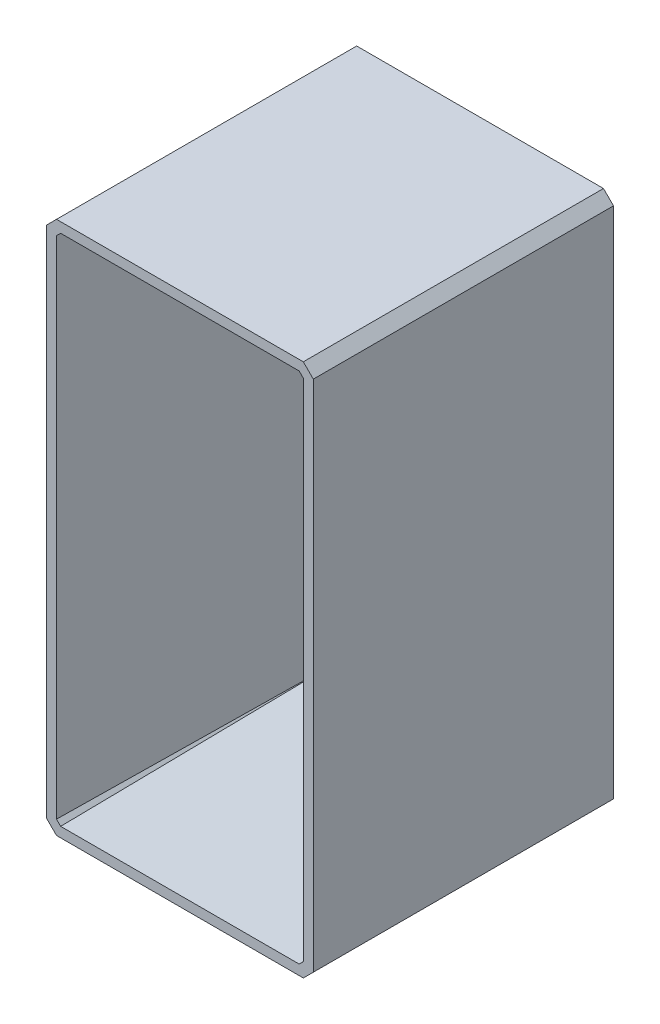
ISO-10303-21;
HEADER;
FILE_DESCRIPTION(('STEP AP214'),'2;1');
FILE_NAME('part.step','',(''),(''),'','','');
FILE_SCHEMA(('AUTOMOTIVE_DESIGN { 1 0 10303 214 1 1 1 1 }'));
ENDSEC;
DATA;
#1=APPLICATION_CONTEXT('core data for automotive mechanical design processes');
#2=APPLICATION_PROTOCOL_DEFINITION('international standard','automotive_design',2000,#1);
#3=PRODUCT_CONTEXT('',#1,'mechanical');
#4=PRODUCT('Part','Part','',(#3));
#5=PRODUCT_RELATED_PRODUCT_CATEGORY('part','',(#4));
#6=PRODUCT_DEFINITION_FORMATION('','',#4);
#7=PRODUCT_DEFINITION_CONTEXT('part definition',#1,'design');
#8=PRODUCT_DEFINITION('design','',#6,#7);
#9=PRODUCT_DEFINITION_SHAPE('','',#8);
#10=(LENGTH_UNIT() NAMED_UNIT(*) SI_UNIT(.MILLI.,.METRE.));
#11=(NAMED_UNIT(*) PLANE_ANGLE_UNIT() SI_UNIT($,.RADIAN.));
#12=(NAMED_UNIT(*) SI_UNIT($,.STERADIAN.) SOLID_ANGLE_UNIT());
#13=UNCERTAINTY_MEASURE_WITH_UNIT(LENGTH_MEASURE(1.E-05),#10,'distance_accuracy_value','');
#14=(GEOMETRIC_REPRESENTATION_CONTEXT(3) GLOBAL_UNCERTAINTY_ASSIGNED_CONTEXT((#13)) GLOBAL_UNIT_ASSIGNED_CONTEXT((#10,
#11,#12)) REPRESENTATION_CONTEXT('',''));
#15=CARTESIAN_POINT('',(0.,0.,0.));
#16=DIRECTION('',(0.,0.,1.));
#17=DIRECTION('',(1.,0.,0.));
#18=AXIS2_PLACEMENT_3D('',#15,#16,#17);
#19=CARTESIAN_POINT('',(40.,80.,90.));
#20=DIRECTION('',(0.,-1.,0.));
#21=DIRECTION('',(0.,0.,-1.));
#22=AXIS2_PLACEMENT_3D('',#19,#20,#21);
#23=PLANE('',#22);
#24=DIRECTION('',(-1.,0.,0.));
#25=VECTOR('',#24,1.);
#26=CARTESIAN_POINT('',(40.,80.,90.));
#27=LINE('',#26,#25);
#28=CARTESIAN_POINT('',(37.,80.,90.));
#29=VERTEX_POINT('',#28);
#30=CARTESIAN_POINT('',(-37.,80.,90.));
#31=VERTEX_POINT('',#30);
#32=EDGE_CURVE('E195',#29,#31,#27,.T.);
#33=ORIENTED_EDGE('',*,*,#32,.F.);
#34=DIRECTION('',(0.,0.,-1.));
#35=VECTOR('',#34,1.);
#36=CARTESIAN_POINT('',(37.,80.,90.));
#37=LINE('',#36,#35);
#38=CARTESIAN_POINT('',(37.,80.,0.));
#39=VERTEX_POINT('',#38);
#40=EDGE_CURVE('E220',#29,#39,#37,.T.);
#41=ORIENTED_EDGE('',*,*,#40,.T.);
#42=DIRECTION('',(-1.,0.,0.));
#43=VECTOR('',#42,1.);
#44=CARTESIAN_POINT('',(40.,80.,0.));
#45=LINE('',#44,#43);
#46=CARTESIAN_POINT('',(-37.,80.,0.));
#47=VERTEX_POINT('',#46);
#48=EDGE_CURVE('E208',#39,#47,#45,.T.);
#49=ORIENTED_EDGE('',*,*,#48,.T.);
#50=DIRECTION('',(0.,0.,1.));
#51=VECTOR('',#50,1.);
#52=CARTESIAN_POINT('',(-37.,80.,90.));
#53=LINE('',#52,#51);
#54=EDGE_CURVE('E207',#47,#31,#53,.T.);
#55=ORIENTED_EDGE('',*,*,#54,.T.);
#56=EDGE_LOOP('',(#33,#41,#49,#55));
#57=FACE_BOUND('',#56,.T.);
#58=ADVANCED_FACE('F43',(#57),#23,.F.);
#59=CARTESIAN_POINT('',(-40.,-80.,90.));
#60=DIRECTION('',(1.,0.,0.));
#61=DIRECTION('',(0.,0.,-1.));
#62=AXIS2_PLACEMENT_3D('',#59,#60,#61);
#63=PLANE('',#62);
#64=DIRECTION('',(0.,-1.,0.));
#65=VECTOR('',#64,1.);
#66=CARTESIAN_POINT('',(-40.,-80.,0.));
#67=LINE('',#66,#65);
#68=CARTESIAN_POINT('',(-40.,77.,0.));
#69=VERTEX_POINT('',#68);
#70=CARTESIAN_POINT('',(-40.,-76.9999999999999,0.));
#71=VERTEX_POINT('',#70);
#72=EDGE_CURVE('E211',#69,#71,#67,.T.);
#73=ORIENTED_EDGE('',*,*,#72,.T.);
#74=DIRECTION('',(0.,0.,1.));
#75=VECTOR('',#74,1.);
#76=CARTESIAN_POINT('',(-40.,-76.9999999999999,90.));
#77=LINE('',#76,#75);
#78=CARTESIAN_POINT('',(-40.,-76.9999999999999,90.));
#79=VERTEX_POINT('',#78);
#80=EDGE_CURVE('E12',#71,#79,#77,.T.);
#81=ORIENTED_EDGE('',*,*,#80,.T.);
#82=DIRECTION('',(0.,-1.,0.));
#83=VECTOR('',#82,1.);
#84=CARTESIAN_POINT('',(-40.,-80.,90.));
#85=LINE('',#84,#83);
#86=CARTESIAN_POINT('',(-40.,77.,90.));
#87=VERTEX_POINT('',#86);
#88=EDGE_CURVE('E198',#87,#79,#85,.T.);
#89=ORIENTED_EDGE('',*,*,#88,.F.);
#90=DIRECTION('',(0.,0.,-1.));
#91=VECTOR('',#90,1.);
#92=CARTESIAN_POINT('',(-40.,77.,90.));
#93=LINE('',#92,#91);
#94=EDGE_CURVE('E52',#87,#69,#93,.T.);
#95=ORIENTED_EDGE('',*,*,#94,.T.);
#96=EDGE_LOOP('',(#73,#81,#89,#95));
#97=FACE_BOUND('',#96,.T.);
#98=ADVANCED_FACE('F252',(#97),#63,.F.);
#99=CARTESIAN_POINT('',(40.,-80.,90.));
#100=DIRECTION('',(0.,1.,0.));
#101=DIRECTION('',(0.,0.,1.));
#102=AXIS2_PLACEMENT_3D('',#99,#100,#101);
#103=PLANE('',#102);
#104=DIRECTION('',(1.,0.,0.));
#105=VECTOR('',#104,1.);
#106=CARTESIAN_POINT('',(40.,-80.,0.));
#107=LINE('',#106,#105);
#108=CARTESIAN_POINT('',(-37.,-80.,0.));
#109=VERTEX_POINT('',#108);
#110=CARTESIAN_POINT('',(37.,-80.,0.));
#111=VERTEX_POINT('',#110);
#112=EDGE_CURVE('E215',#109,#111,#107,.T.);
#113=ORIENTED_EDGE('',*,*,#112,.T.);
#114=DIRECTION('',(0.,0.,1.));
#115=VECTOR('',#114,1.);
#116=CARTESIAN_POINT('',(37.,-80.,90.));
#117=LINE('',#116,#115);
#118=CARTESIAN_POINT('',(37.,-80.,90.));
#119=VERTEX_POINT('',#118);
#120=EDGE_CURVE('E67',#111,#119,#117,.T.);
#121=ORIENTED_EDGE('',*,*,#120,.T.);
#122=DIRECTION('',(1.,0.,0.));
#123=VECTOR('',#122,1.);
#124=CARTESIAN_POINT('',(40.,-80.,90.));
#125=LINE('',#124,#123);
#126=CARTESIAN_POINT('',(-37.,-80.,90.));
#127=VERTEX_POINT('',#126);
#128=EDGE_CURVE('E202',#127,#119,#125,.T.);
#129=ORIENTED_EDGE('',*,*,#128,.F.);
#130=DIRECTION('',(0.,0.,-1.));
#131=VECTOR('',#130,1.);
#132=CARTESIAN_POINT('',(-37.,-80.,90.));
#133=LINE('',#132,#131);
#134=EDGE_CURVE('E244',#127,#109,#133,.T.);
#135=ORIENTED_EDGE('',*,*,#134,.T.);
#136=EDGE_LOOP('',(#113,#121,#129,#135));
#137=FACE_BOUND('',#136,.T.);
#138=ADVANCED_FACE('F264',(#137),#103,.F.);
#139=CARTESIAN_POINT('',(40.,-80.,90.));
#140=DIRECTION('',(-1.,0.,0.));
#141=DIRECTION('',(0.,0.,1.));
#142=AXIS2_PLACEMENT_3D('',#139,#140,#141);
#143=PLANE('',#142);
#144=DIRECTION('',(0.,1.,0.));
#145=VECTOR('',#144,1.);
#146=CARTESIAN_POINT('',(40.,-80.,0.));
#147=LINE('',#146,#145);
#148=CARTESIAN_POINT('',(40.,-77.,0.));
#149=VERTEX_POINT('',#148);
#150=CARTESIAN_POINT('',(40.,76.9999999999999,0.));
#151=VERTEX_POINT('',#150);
#152=EDGE_CURVE('E199',#149,#151,#147,.T.);
#153=ORIENTED_EDGE('',*,*,#152,.T.);
#154=DIRECTION('',(0.,0.,1.));
#155=VECTOR('',#154,1.);
#156=CARTESIAN_POINT('',(40.,76.9999999999999,90.));
#157=LINE('',#156,#155);
#158=CARTESIAN_POINT('',(40.,76.9999999999999,90.));
#159=VERTEX_POINT('',#158);
#160=EDGE_CURVE('E234',#151,#159,#157,.T.);
#161=ORIENTED_EDGE('',*,*,#160,.T.);
#162=DIRECTION('',(0.,1.,0.));
#163=VECTOR('',#162,1.);
#164=CARTESIAN_POINT('',(40.,-80.,90.));
#165=LINE('',#164,#163);
#166=CARTESIAN_POINT('',(40.,-77.,90.));
#167=VERTEX_POINT('',#166);
#168=EDGE_CURVE('E204',#167,#159,#165,.T.);
#169=ORIENTED_EDGE('',*,*,#168,.F.);
#170=DIRECTION('',(0.,0.,-1.));
#171=VECTOR('',#170,1.);
#172=CARTESIAN_POINT('',(40.,-77.,90.));
#173=LINE('',#172,#171);
#174=EDGE_CURVE('E231',#167,#149,#173,.T.);
#175=ORIENTED_EDGE('',*,*,#174,.T.);
#176=EDGE_LOOP('',(#153,#161,#169,#175));
#177=FACE_BOUND('',#176,.T.);
#178=ADVANCED_FACE('F274',(#177),#143,.F.);
#179=CARTESIAN_POINT('',(0.,0.,90.));
#180=DIRECTION('',(0.,0.,-1.));
#181=DIRECTION('',(-1.,0.,0.));
#182=AXIS2_PLACEMENT_3D('',#179,#180,#181);
#183=PLANE('',#182);
#184=DIRECTION('',(1.,0.,0.));
#185=VECTOR('',#184,1.);
#186=CARTESIAN_POINT('',(-35.7573593128807,-77.,90.));
#187=LINE('',#186,#185);
#188=CARTESIAN_POINT('',(-35.7573593128807,-77.,90.));
#189=VERTEX_POINT('',#188);
#190=CARTESIAN_POINT('',(35.7573593128807,-77.,90.));
#191=VERTEX_POINT('',#190);
#192=EDGE_CURVE('E212',#189,#191,#187,.T.);
#193=ORIENTED_EDGE('',*,*,#192,.F.);
#194=DIRECTION('',(0.707106781186544,-0.707106781186551,0.));
#195=VECTOR('',#194,1.);
#196=CARTESIAN_POINT('',(-37.,-75.7573593128807,90.));
#197=LINE('',#196,#195);
#198=CARTESIAN_POINT('',(-37.,-75.7573593128807,90.));
#199=VERTEX_POINT('',#198);
#200=EDGE_CURVE('E463',#199,#189,#197,.T.);
#201=ORIENTED_EDGE('',*,*,#200,.F.);
#202=DIRECTION('',(0.,-1.,0.));
#203=VECTOR('',#202,1.);
#204=CARTESIAN_POINT('',(-37.,75.7573593128807,90.));
#205=LINE('',#204,#203);
#206=CARTESIAN_POINT('',(-37.,75.7573593128807,90.));
#207=VERTEX_POINT('',#206);
#208=EDGE_CURVE('E467',#207,#199,#205,.T.);
#209=ORIENTED_EDGE('',*,*,#208,.F.);
#210=DIRECTION('',(-0.707106781186549,-0.707106781186546,0.));
#211=VECTOR('',#210,1.);
#212=CARTESIAN_POINT('',(-35.7573593128807,77.,90.));
#213=LINE('',#212,#211);
#214=CARTESIAN_POINT('',(-35.7573593128807,77.,90.));
#215=VERTEX_POINT('',#214);
#216=EDGE_CURVE('E474',#215,#207,#213,.T.);
#217=ORIENTED_EDGE('',*,*,#216,.F.);
#218=DIRECTION('',(-1.,0.,0.));
#219=VECTOR('',#218,1.);
#220=CARTESIAN_POINT('',(35.7573593128807,77.,90.));
#221=LINE('',#220,#219);
#222=CARTESIAN_POINT('',(35.7573593128807,77.,90.));
#223=VERTEX_POINT('',#222);
#224=EDGE_CURVE('E477',#223,#215,#221,.T.);
#225=ORIENTED_EDGE('',*,*,#224,.F.);
#226=DIRECTION('',(-0.707106781186544,0.707106781186552,0.));
#227=VECTOR('',#226,1.);
#228=CARTESIAN_POINT('',(37.,75.7573593128807,90.));
#229=LINE('',#228,#227);
#230=CARTESIAN_POINT('',(37.,75.7573593128807,90.));
#231=VERTEX_POINT('',#230);
#232=EDGE_CURVE('E480',#231,#223,#229,.T.);
#233=ORIENTED_EDGE('',*,*,#232,.F.);
#234=DIRECTION('',(0.,1.,0.));
#235=VECTOR('',#234,1.);
#236=CARTESIAN_POINT('',(37.,-75.7573593128807,90.));
#237=LINE('',#236,#235);
#238=CARTESIAN_POINT('',(37.,-75.7573593128807,90.));
#239=VERTEX_POINT('',#238);
#240=EDGE_CURVE('E59',#239,#231,#237,.T.);
#241=ORIENTED_EDGE('',*,*,#240,.F.);
#242=DIRECTION('',(0.707106781186546,0.707106781186549,0.));
#243=VECTOR('',#242,1.);
#244=CARTESIAN_POINT('',(35.7573593128807,-77.,90.));
#245=LINE('',#244,#243);
#246=EDGE_CURVE('E184',#191,#239,#245,.T.);
#247=ORIENTED_EDGE('',*,*,#246,.F.);
#248=EDGE_LOOP('',(#193,#201,#209,#217,#225,#233,#241,#247));
#249=FACE_BOUND('',#248,.T.);
#250=ORIENTED_EDGE('',*,*,#168,.T.);
#251=DIRECTION('',(0.707106781186538,-0.707106781186557,0.));
#252=VECTOR('',#251,1.);
#253=CARTESIAN_POINT('',(37.,80.,90.));
#254=LINE('',#253,#252);
#255=EDGE_CURVE('E242',#159,#29,#254,.F.);
#256=ORIENTED_EDGE('',*,*,#255,.T.);
#257=ORIENTED_EDGE('',*,*,#32,.T.);
#258=DIRECTION('',(0.707106781186549,0.707106781186546,0.));
#259=VECTOR('',#258,1.);
#260=CARTESIAN_POINT('',(-40.,77.,90.));
#261=LINE('',#260,#259);
#262=EDGE_CURVE('E236',#31,#87,#261,.F.);
#263=ORIENTED_EDGE('',*,*,#262,.T.);
#264=ORIENTED_EDGE('',*,*,#88,.T.);
#265=DIRECTION('',(-0.707106781186543,0.707106781186552,0.));
#266=VECTOR('',#265,1.);
#267=CARTESIAN_POINT('',(-37.,-80.,90.));
#268=LINE('',#267,#266);
#269=EDGE_CURVE('E238',#79,#127,#268,.F.);
#270=ORIENTED_EDGE('',*,*,#269,.T.);
#271=ORIENTED_EDGE('',*,*,#128,.T.);
#272=DIRECTION('',(-0.707106781186551,-0.707106781186544,0.));
#273=VECTOR('',#272,1.);
#274=CARTESIAN_POINT('',(40.,-77.,90.));
#275=LINE('',#274,#273);
#276=EDGE_CURVE('E240',#119,#167,#275,.F.);
#277=ORIENTED_EDGE('',*,*,#276,.T.);
#278=EDGE_LOOP('',(#250,#256,#257,#263,#264,#270,#271,#277));
#279=FACE_BOUND('',#278,.T.);
#280=ADVANCED_FACE('F267',(#249,#279),#183,.F.);
#281=CARTESIAN_POINT('',(0.,0.,0.));
#282=DIRECTION('',(0.,0.,-1.));
#283=DIRECTION('',(-1.,0.,0.));
#284=AXIS2_PLACEMENT_3D('',#281,#282,#283);
#285=PLANE('',#284);
#286=ORIENTED_EDGE('',*,*,#48,.F.);
#287=DIRECTION('',(-0.707106781186538,0.707106781186557,0.));
#288=VECTOR('',#287,1.);
#289=CARTESIAN_POINT('',(58.5000000000005,58.4999999999989,0.));
#290=LINE('',#289,#288);
#291=EDGE_CURVE('E229',#39,#151,#290,.F.);
#292=ORIENTED_EDGE('',*,*,#291,.T.);
#293=ORIENTED_EDGE('',*,*,#152,.F.);
#294=DIRECTION('',(0.707106781186551,0.707106781186544,0.));
#295=VECTOR('',#294,1.);
#296=CARTESIAN_POINT('',(58.4999999999998,-58.5000000000004,0.));
#297=LINE('',#296,#295);
#298=EDGE_CURVE('E227',#149,#111,#297,.F.);
#299=ORIENTED_EDGE('',*,*,#298,.T.);
#300=ORIENTED_EDGE('',*,*,#112,.F.);
#301=DIRECTION('',(0.707106781186543,-0.707106781186552,0.));
#302=VECTOR('',#301,1.);
#303=CARTESIAN_POINT('',(-58.5000000000002,-58.4999999999994,0.));
#304=LINE('',#303,#302);
#305=EDGE_CURVE('E225',#109,#71,#304,.F.);
#306=ORIENTED_EDGE('',*,*,#305,.T.);
#307=ORIENTED_EDGE('',*,*,#72,.F.);
#308=DIRECTION('',(-0.707106781186549,-0.707106781186546,0.));
#309=VECTOR('',#308,1.);
#310=CARTESIAN_POINT('',(-58.4999999999999,58.5000000000002,0.));
#311=LINE('',#310,#309);
#312=EDGE_CURVE('E223',#69,#47,#311,.F.);
#313=ORIENTED_EDGE('',*,*,#312,.T.);
#314=EDGE_LOOP('',(#286,#292,#293,#299,#300,#306,#307,#313));
#315=FACE_BOUND('',#314,.T.);
#316=ADVANCED_FACE('F258',(#315),#285,.T.);
#317=CARTESIAN_POINT('',(37.,80.,90.));
#318=DIRECTION('',(-0.707106781186557,-0.707106781186538,0.));
#319=DIRECTION('',(0.,0.,-1.));
#320=AXIS2_PLACEMENT_3D('',#317,#318,#319);
#321=PLANE('',#320);
#322=ORIENTED_EDGE('',*,*,#255,.F.);
#323=ORIENTED_EDGE('',*,*,#160,.F.);
#324=ORIENTED_EDGE('',*,*,#291,.F.);
#325=ORIENTED_EDGE('',*,*,#40,.F.);
#326=EDGE_LOOP('',(#322,#323,#324,#325));
#327=FACE_BOUND('',#326,.T.);
#328=ADVANCED_FACE('F279',(#327),#321,.F.);
#329=CARTESIAN_POINT('',(40.,-77.,90.));
#330=DIRECTION('',(-0.707106781186544,0.707106781186551,0.));
#331=DIRECTION('',(0.,0.,-1.));
#332=AXIS2_PLACEMENT_3D('',#329,#330,#331);
#333=PLANE('',#332);
#334=ORIENTED_EDGE('',*,*,#276,.F.);
#335=ORIENTED_EDGE('',*,*,#120,.F.);
#336=ORIENTED_EDGE('',*,*,#298,.F.);
#337=ORIENTED_EDGE('',*,*,#174,.F.);
#338=EDGE_LOOP('',(#334,#335,#336,#337));
#339=FACE_BOUND('',#338,.T.);
#340=ADVANCED_FACE('F271',(#339),#333,.F.);
#341=CARTESIAN_POINT('',(-37.,-80.,90.));
#342=DIRECTION('',(0.707106781186552,0.707106781186543,0.));
#343=DIRECTION('',(0.,0.,-1.));
#344=AXIS2_PLACEMENT_3D('',#341,#342,#343);
#345=PLANE('',#344);
#346=ORIENTED_EDGE('',*,*,#269,.F.);
#347=ORIENTED_EDGE('',*,*,#80,.F.);
#348=ORIENTED_EDGE('',*,*,#305,.F.);
#349=ORIENTED_EDGE('',*,*,#134,.F.);
#350=EDGE_LOOP('',(#346,#347,#348,#349));
#351=FACE_BOUND('',#350,.T.);
#352=ADVANCED_FACE('F263',(#351),#345,.F.);
#353=CARTESIAN_POINT('',(-40.,77.,90.));
#354=DIRECTION('',(0.707106781186546,-0.707106781186549,0.));
#355=DIRECTION('',(0.,0.,-1.));
#356=AXIS2_PLACEMENT_3D('',#353,#354,#355);
#357=PLANE('',#356);
#358=ORIENTED_EDGE('',*,*,#262,.F.);
#359=ORIENTED_EDGE('',*,*,#54,.F.);
#360=ORIENTED_EDGE('',*,*,#312,.F.);
#361=ORIENTED_EDGE('',*,*,#94,.F.);
#362=EDGE_LOOP('',(#358,#359,#360,#361));
#363=FACE_BOUND('',#362,.T.);
#364=ADVANCED_FACE('F46',(#363),#357,.F.);
#365=CARTESIAN_POINT('',(-35.7573593128807,-77.,90.));
#366=DIRECTION('',(0.,-0.999657324975557,-0.0261769483078732));
#367=DIRECTION('',(0.,0.0261769483078732,-0.999657324975557));
#368=AXIS2_PLACEMENT_3D('',#365,#366,#367);
#369=PLANE('',#368);
#370=DIRECTION('',(-0.0261679842649794,-0.0261679842649794,0.99931500198837));
#371=VECTOR('',#370,1.);
#372=CARTESIAN_POINT('',(-36.8953973511867,-76.8953973511867,86.0053860034323));
#373=LINE('',#372,#371);
#374=CARTESIAN_POINT('',(-34.7218248234807,-74.7218248234807,3.));
#375=VERTEX_POINT('',#374);
#376=CARTESIAN_POINT('',(-34.8786796564403,-74.8786796564403,8.99004440401987));
#377=VERTEX_POINT('',#376);
#378=EDGE_CURVE('E189',#375,#377,#373,.T.);
#379=ORIENTED_EDGE('',*,*,#378,.T.);
#380=DIRECTION('',(-0.0108422096845633,-0.0261754096665653,0.999598566634598));
#381=VECTOR('',#380,1.);
#382=CARTESIAN_POINT('',(-35.7571527291236,-76.999501262692,89.9809539906127));
#383=LINE('',#382,#381);
#384=EDGE_CURVE('E486',#377,#189,#383,.T.);
#385=ORIENTED_EDGE('',*,*,#384,.T.);
#386=ORIENTED_EDGE('',*,*,#192,.T.);
#387=DIRECTION('',(0.0108422096845632,-0.0261754096665653,0.999598566634598));
#388=VECTOR('',#387,1.);
#389=CARTESIAN_POINT('',(35.7489525066293,-76.9797041743314,89.2249336875563));
#390=LINE('',#389,#388);
#391=CARTESIAN_POINT('',(34.8786796564404,-74.8786796564404,8.99004440402137));
#392=VERTEX_POINT('',#391);
#393=EDGE_CURVE('E190',#392,#191,#390,.T.);
#394=ORIENTED_EDGE('',*,*,#393,.F.);
#395=DIRECTION('',(0.0261679842649794,-0.0261679842649794,0.99931500198837));
#396=VECTOR('',#395,1.);
#397=CARTESIAN_POINT('',(36.9501784232261,-76.9501784232261,88.0973907432555));
#398=LINE('',#397,#396);
#399=CARTESIAN_POINT('',(34.7218248234807,-74.7218248234807,3.));
#400=VERTEX_POINT('',#399);
#401=EDGE_CURVE('E187',#400,#392,#398,.T.);
#402=ORIENTED_EDGE('',*,*,#401,.F.);
#403=DIRECTION('',(1.,0.,0.));
#404=VECTOR('',#403,1.);
#405=CARTESIAN_POINT('',(-35.7573593128807,-74.7218248234807,3.));
#406=LINE('',#405,#404);
#407=EDGE_CURVE('E177',#375,#400,#406,.T.);
#408=ORIENTED_EDGE('',*,*,#407,.F.);
#409=EDGE_LOOP('',(#379,#385,#386,#394,#402,#408));
#410=FACE_BOUND('',#409,.T.);
#411=ADVANCED_FACE('F284',(#410),#369,.F.);
#412=CARTESIAN_POINT('',(-37.,75.7573593128807,90.));
#413=DIRECTION('',(-0.999657324975557,0.,-0.0261769483078732));
#414=DIRECTION('',(-0.0261769483078732,0.,0.999657324975557));
#415=AXIS2_PLACEMENT_3D('',#412,#413,#414);
#416=PLANE('',#415);
#417=DIRECTION('',(-0.0261679842649794,0.0261679842649794,0.99931500198837));
#418=VECTOR('',#417,1.);
#419=CARTESIAN_POINT('',(-36.9501784232261,76.950178423226,88.0973907432555));
#420=LINE('',#419,#418);
#421=CARTESIAN_POINT('',(-34.7218248234807,74.7218248234807,3.));
#422=VERTEX_POINT('',#421);
#423=CARTESIAN_POINT('',(-34.8786796564404,74.8786796564404,8.99004440402208));
#424=VERTEX_POINT('',#423);
#425=EDGE_CURVE('E165',#422,#424,#420,.T.);
#426=ORIENTED_EDGE('',*,*,#425,.T.);
#427=DIRECTION('',(-0.0261754096665653,0.0108422096845632,0.999598566634598));
#428=VECTOR('',#427,1.);
#429=CARTESIAN_POINT('',(-36.999501262692,75.7571527291237,89.9809539906127));
#430=LINE('',#429,#428);
#431=EDGE_CURVE('E484',#424,#207,#430,.T.);
#432=ORIENTED_EDGE('',*,*,#431,.T.);
#433=ORIENTED_EDGE('',*,*,#208,.T.);
#434=DIRECTION('',(-0.0261754096665653,-0.0108422096845631,0.999598566634598));
#435=VECTOR('',#434,1.);
#436=CARTESIAN_POINT('',(-36.9570002319167,-75.7395482257617,88.357905106769));
#437=LINE('',#436,#435);
#438=EDGE_CURVE('E169',#377,#199,#437,.T.);
#439=ORIENTED_EDGE('',*,*,#438,.F.);
#440=ORIENTED_EDGE('',*,*,#378,.F.);
#441=DIRECTION('',(0.,-1.,0.));
#442=VECTOR('',#441,1.);
#443=CARTESIAN_POINT('',(-34.7218248234807,75.7573593128807,3.));
#444=LINE('',#443,#442);
#445=EDGE_CURVE('E188',#422,#375,#444,.T.);
#446=ORIENTED_EDGE('',*,*,#445,.F.);
#447=EDGE_LOOP('',(#426,#432,#433,#439,#440,#446));
#448=FACE_BOUND('',#447,.T.);
#449=ADVANCED_FACE('F290',(#448),#416,.F.);
#450=CARTESIAN_POINT('',(35.7573593128807,77.,90.));
#451=DIRECTION('',(0.,0.999657324975557,-0.0261769483078732));
#452=DIRECTION('',(0.,0.0261769483078732,0.999657324975557));
#453=AXIS2_PLACEMENT_3D('',#450,#451,#452);
#454=PLANE('',#453);
#455=DIRECTION('',(0.0261679842649794,0.0261679842649794,0.99931500198837));
#456=VECTOR('',#455,1.);
#457=CARTESIAN_POINT('',(36.8953973511867,76.8953973511867,86.0053860034323));
#458=LINE('',#457,#456);
#459=CARTESIAN_POINT('',(34.7218248234807,74.7218248234807,3.));
#460=VERTEX_POINT('',#459);
#461=CARTESIAN_POINT('',(34.8786796564403,74.8786796564403,8.99004440401905));
#462=VERTEX_POINT('',#461);
#463=EDGE_CURVE('E162',#460,#462,#458,.T.);
#464=ORIENTED_EDGE('',*,*,#463,.T.);
#465=DIRECTION('',(0.0108422096845632,0.0261754096665653,0.999598566634598));
#466=VECTOR('',#465,1.);
#467=CARTESIAN_POINT('',(35.7571527291236,76.999501262692,89.9809539906127));
#468=LINE('',#467,#466);
#469=EDGE_CURVE('E482',#462,#223,#468,.T.);
#470=ORIENTED_EDGE('',*,*,#469,.T.);
#471=ORIENTED_EDGE('',*,*,#224,.T.);
#472=DIRECTION('',(-0.0108422096845631,0.0261754096665653,0.999598566634598));
#473=VECTOR('',#472,1.);
#474=CARTESIAN_POINT('',(-35.7489525066293,76.9797041743314,89.2249336875563));
#475=LINE('',#474,#473);
#476=EDGE_CURVE('E179',#424,#215,#475,.T.);
#477=ORIENTED_EDGE('',*,*,#476,.F.);
#478=ORIENTED_EDGE('',*,*,#425,.F.);
#479=DIRECTION('',(-1.,0.,0.));
#480=VECTOR('',#479,1.);
#481=CARTESIAN_POINT('',(35.7573593128807,74.7218248234807,3.));
#482=LINE('',#481,#480);
#483=EDGE_CURVE('E159',#460,#422,#482,.T.);
#484=ORIENTED_EDGE('',*,*,#483,.F.);
#485=EDGE_LOOP('',(#464,#470,#471,#477,#478,#484));
#486=FACE_BOUND('',#485,.T.);
#487=ADVANCED_FACE('F161',(#486),#454,.F.);
#488=CARTESIAN_POINT('',(37.,-75.7573593128807,90.));
#489=DIRECTION('',(0.999657324975557,0.,-0.0261769483078732));
#490=DIRECTION('',(-0.0261769483078732,0.,-0.999657324975557));
#491=AXIS2_PLACEMENT_3D('',#488,#489,#490);
#492=PLANE('',#491);
#493=ORIENTED_EDGE('',*,*,#401,.T.);
#494=DIRECTION('',(0.0261754096665653,-0.0108422096845631,0.999598566634598));
#495=VECTOR('',#494,1.);
#496=CARTESIAN_POINT('',(36.999501262692,-75.7571527291237,89.9809539906127));
#497=LINE('',#496,#495);
#498=EDGE_CURVE('E489',#392,#239,#497,.T.);
#499=ORIENTED_EDGE('',*,*,#498,.T.);
#500=ORIENTED_EDGE('',*,*,#240,.T.);
#501=DIRECTION('',(0.0261754096665653,0.0108422096845631,0.999598566634598));
#502=VECTOR('',#501,1.);
#503=CARTESIAN_POINT('',(36.9570002319167,75.7395482257617,88.357905106769));
#504=LINE('',#503,#502);
#505=EDGE_CURVE('E174',#462,#231,#504,.T.);
#506=ORIENTED_EDGE('',*,*,#505,.F.);
#507=ORIENTED_EDGE('',*,*,#463,.F.);
#508=DIRECTION('',(0.,1.,0.));
#509=VECTOR('',#508,1.);
#510=CARTESIAN_POINT('',(34.7218248234807,-75.7573593128807,3.));
#511=LINE('',#510,#509);
#512=EDGE_CURVE('E172',#400,#460,#511,.T.);
#513=ORIENTED_EDGE('',*,*,#512,.F.);
#514=EDGE_LOOP('',(#493,#499,#500,#506,#507,#513));
#515=FACE_BOUND('',#514,.T.);
#516=ADVANCED_FACE('F171',(#515),#492,.F.);
#517=CARTESIAN_POINT('',(35.7573593128807,-77.,90.));
#518=DIRECTION('',(0.706864473353023,-0.706864473353019,-0.0261769483078732));
#519=DIRECTION('',(0.707106781186546,0.707106781186549,0.));
#520=AXIS2_PLACEMENT_3D('',#517,#518,#519);
#521=PLANE('',#520);
#522=ORIENTED_EDGE('',*,*,#246,.T.);
#523=ORIENTED_EDGE('',*,*,#498,.F.);
#524=ORIENTED_EDGE('',*,*,#393,.T.);
#525=EDGE_LOOP('',(#522,#523,#524));
#526=FACE_BOUND('',#525,.T.);
#527=ADVANCED_FACE('F362',(#526),#521,.F.);
#528=CARTESIAN_POINT('',(-37.,-75.7573593128807,90.));
#529=DIRECTION('',(-0.706864473353025,-0.706864473353017,-0.0261769483078732));
#530=DIRECTION('',(0.707106781186544,-0.707106781186551,0.));
#531=AXIS2_PLACEMENT_3D('',#528,#529,#530);
#532=PLANE('',#531);
#533=ORIENTED_EDGE('',*,*,#200,.T.);
#534=ORIENTED_EDGE('',*,*,#384,.F.);
#535=ORIENTED_EDGE('',*,*,#438,.T.);
#536=EDGE_LOOP('',(#533,#534,#535));
#537=FACE_BOUND('',#536,.T.);
#538=ADVANCED_FACE('F371',(#537),#532,.F.);
#539=CARTESIAN_POINT('',(-35.7573593128807,77.,90.));
#540=DIRECTION('',(-0.706864473353019,0.706864473353023,-0.0261769483078732));
#541=DIRECTION('',(-0.707106781186549,-0.707106781186546,0.));
#542=AXIS2_PLACEMENT_3D('',#539,#540,#541);
#543=PLANE('',#542);
#544=ORIENTED_EDGE('',*,*,#216,.T.);
#545=ORIENTED_EDGE('',*,*,#431,.F.);
#546=ORIENTED_EDGE('',*,*,#476,.T.);
#547=EDGE_LOOP('',(#544,#545,#546));
#548=FACE_BOUND('',#547,.T.);
#549=ADVANCED_FACE('F381',(#548),#543,.F.);
#550=CARTESIAN_POINT('',(37.,75.7573593128807,90.));
#551=DIRECTION('',(0.706864473353025,0.706864473353017,-0.0261769483078732));
#552=DIRECTION('',(-0.707106781186544,0.707106781186552,0.));
#553=AXIS2_PLACEMENT_3D('',#550,#551,#552);
#554=PLANE('',#553);
#555=ORIENTED_EDGE('',*,*,#232,.T.);
#556=ORIENTED_EDGE('',*,*,#469,.F.);
#557=ORIENTED_EDGE('',*,*,#505,.T.);
#558=EDGE_LOOP('',(#555,#556,#557));
#559=FACE_BOUND('',#558,.T.);
#560=ADVANCED_FACE('F391',(#559),#554,.F.);
#561=CARTESIAN_POINT('',(0.,0.,3.));
#562=DIRECTION('',(0.,0.,-1.));
#563=DIRECTION('',(-1.,0.,0.));
#564=AXIS2_PLACEMENT_3D('',#561,#562,#563);
#565=PLANE('',#564);
#566=ORIENTED_EDGE('',*,*,#407,.T.);
#567=ORIENTED_EDGE('',*,*,#512,.T.);
#568=ORIENTED_EDGE('',*,*,#483,.T.);
#569=ORIENTED_EDGE('',*,*,#445,.T.);
#570=EDGE_LOOP('',(#566,#567,#568,#569));
#571=FACE_BOUND('',#570,.T.);
#572=ADVANCED_FACE('F176',(#571),#565,.F.);
#573=CLOSED_SHELL('',(#58,#98,#138,#178,#280,#316,#328,#340,#352,#364,#411,#449,#487,#516,#527,
#538,#549,#560,#572));
#574=MANIFOLD_SOLID_BREP('B2',#573);
#575=ADVANCED_BREP_SHAPE_REPRESENTATION('',(#18,#574),#14);
#576=SHAPE_DEFINITION_REPRESENTATION(#9,#575);
ENDSEC;
END-ISO-10303-21;
